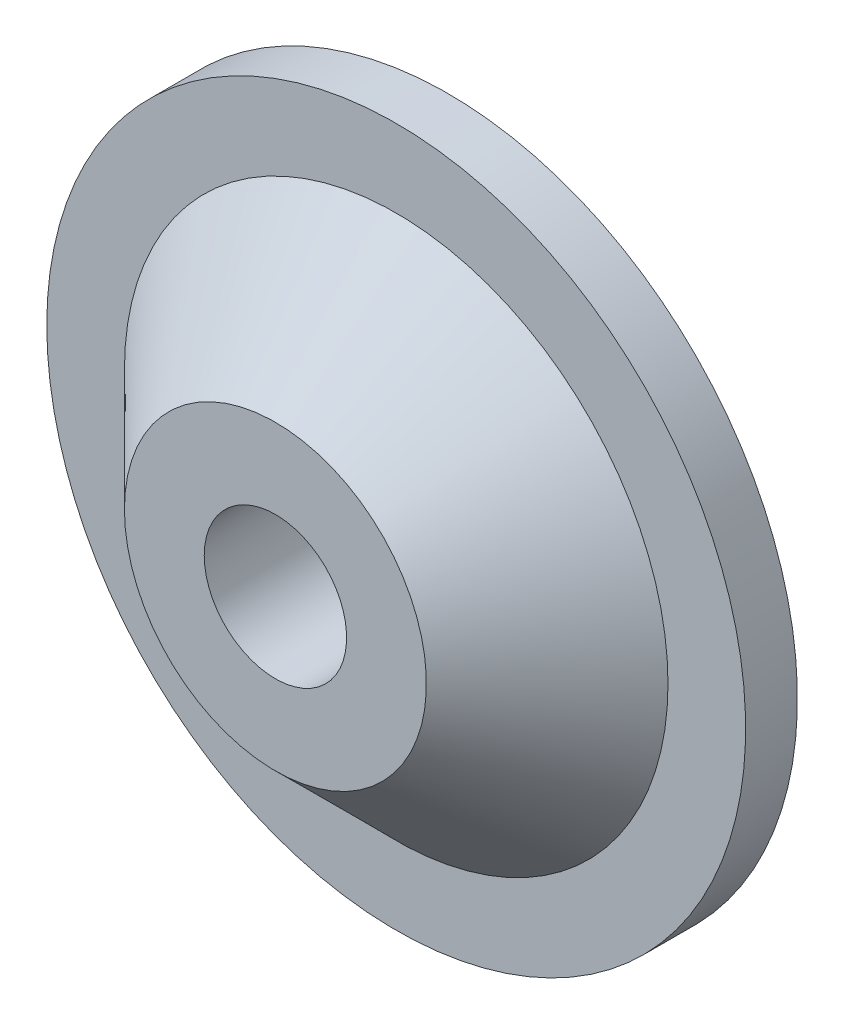
ISO-10303-21;
HEADER;
FILE_DESCRIPTION(('STEP AP214'),'2;1');
FILE_NAME('part.step','',(''),(''),'','','');
FILE_SCHEMA(('AUTOMOTIVE_DESIGN { 1 0 10303 214 1 1 1 1 }'));
ENDSEC;
DATA;
#1=APPLICATION_CONTEXT('core data for automotive mechanical design processes');
#2=APPLICATION_PROTOCOL_DEFINITION('international standard','automotive_design',2000,#1);
#3=PRODUCT_CONTEXT('',#1,'mechanical');
#4=PRODUCT('Part','Part','',(#3));
#5=PRODUCT_RELATED_PRODUCT_CATEGORY('part','',(#4));
#6=PRODUCT_DEFINITION_FORMATION('','',#4);
#7=PRODUCT_DEFINITION_CONTEXT('part definition',#1,'design');
#8=PRODUCT_DEFINITION('design','',#6,#7);
#9=PRODUCT_DEFINITION_SHAPE('','',#8);
#10=(LENGTH_UNIT() NAMED_UNIT(*) SI_UNIT(.MILLI.,.METRE.));
#11=(NAMED_UNIT(*) PLANE_ANGLE_UNIT() SI_UNIT($,.RADIAN.));
#12=(NAMED_UNIT(*) SI_UNIT($,.STERADIAN.) SOLID_ANGLE_UNIT());
#13=UNCERTAINTY_MEASURE_WITH_UNIT(LENGTH_MEASURE(1.E-05),#10,'distance_accuracy_value','');
#14=(GEOMETRIC_REPRESENTATION_CONTEXT(3) GLOBAL_UNCERTAINTY_ASSIGNED_CONTEXT((#13)) GLOBAL_UNIT_ASSIGNED_CONTEXT((#10,
#11,#12)) REPRESENTATION_CONTEXT('',''));
#15=CARTESIAN_POINT('',(0.,0.,0.));
#16=DIRECTION('',(0.,0.,1.));
#17=DIRECTION('',(1.,0.,0.));
#18=AXIS2_PLACEMENT_3D('',#15,#16,#17);
#19=CARTESIAN_POINT('',(0.,0.,2.8));
#20=DIRECTION('',(0.,0.,-1.));
#21=DIRECTION('',(-1.,0.,0.));
#22=AXIS2_PLACEMENT_3D('',#19,#20,#21);
#23=PLANE('',#22);
#24=CARTESIAN_POINT('',(0.,0.,2.8));
#25=DIRECTION('',(0.,0.,-1.));
#26=DIRECTION('',(-1.,0.,0.));
#27=AXIS2_PLACEMENT_3D('',#24,#25,#26);
#28=CIRCLE('',#27,3.5);
#29=CARTESIAN_POINT('',(-3.5,0.,2.8));
#30=VERTEX_POINT('',#29);
#31=EDGE_CURVE('E47',#30,#30,#28,.T.);
#32=ORIENTED_EDGE('',*,*,#31,.F.);
#33=EDGE_LOOP('',(#32));
#34=FACE_BOUND('',#33,.T.);
#35=CARTESIAN_POINT('',(0.,0.,2.8));
#36=DIRECTION('',(0.,0.,-1.));
#37=DIRECTION('',(-1.,0.,0.));
#38=AXIS2_PLACEMENT_3D('',#35,#36,#37);
#39=CIRCLE('',#38,1.65000000000001);
#40=CARTESIAN_POINT('',(-1.65000000000001,0.,2.8));
#41=VERTEX_POINT('',#40);
#42=EDGE_CURVE('E62',#41,#41,#39,.T.);
#43=ORIENTED_EDGE('',*,*,#42,.T.);
#44=EDGE_LOOP('',(#43));
#45=FACE_BOUND('',#44,.T.);
#46=ADVANCED_FACE('F36',(#34,#45),#23,.F.);
#47=CARTESIAN_POINT('',(0.,0.,2.8));
#48=DIRECTION('',(0.,0.,-1.));
#49=DIRECTION('',(-1.,0.,0.));
#50=AXIS2_PLACEMENT_3D('',#47,#48,#49);
#51=CONICAL_SURFACE('',#50,3.5,0.785398163397446);
#52=CARTESIAN_POINT('',(0.,0.,0.));
#53=DIRECTION('',(0.,0.,-1.));
#54=DIRECTION('',(-1.,0.,0.));
#55=AXIS2_PLACEMENT_3D('',#52,#53,#54);
#56=CIRCLE('',#55,6.29999999999998);
#57=CARTESIAN_POINT('',(-6.29999999999998,0.,0.));
#58=VERTEX_POINT('',#57);
#59=EDGE_CURVE('E51',#58,#58,#56,.T.);
#60=ORIENTED_EDGE('',*,*,#59,.F.);
#61=EDGE_LOOP('',(#60));
#62=FACE_BOUND('',#61,.T.);
#63=ORIENTED_EDGE('',*,*,#31,.T.);
#64=EDGE_LOOP('',(#63));
#65=FACE_BOUND('',#64,.T.);
#66=ADVANCED_FACE('F79',(#62,#65),#51,.T.);
#67=CARTESIAN_POINT('',(0.,0.,0.));
#68=DIRECTION('',(0.,0.,-1.));
#69=DIRECTION('',(-1.,0.,0.));
#70=AXIS2_PLACEMENT_3D('',#67,#68,#69);
#71=PLANE('',#70);
#72=CARTESIAN_POINT('',(0.,0.,0.));
#73=DIRECTION('',(0.,0.,-1.));
#74=DIRECTION('',(-1.,0.,0.));
#75=AXIS2_PLACEMENT_3D('',#72,#73,#74);
#76=CIRCLE('',#75,8.1);
#77=CARTESIAN_POINT('',(-8.1,0.,0.));
#78=VERTEX_POINT('',#77);
#79=EDGE_CURVE('E56',#78,#78,#76,.T.);
#80=ORIENTED_EDGE('',*,*,#79,.F.);
#81=EDGE_LOOP('',(#80));
#82=FACE_BOUND('',#81,.T.);
#83=ORIENTED_EDGE('',*,*,#59,.T.);
#84=EDGE_LOOP('',(#83));
#85=FACE_BOUND('',#84,.T.);
#86=ADVANCED_FACE('F84',(#82,#85),#71,.F.);
#87=CARTESIAN_POINT('',(0.,0.,-35.5800768174737));
#88=DIRECTION('',(0.,0.,-1.));
#89=DIRECTION('',(-1.,0.,0.));
#90=AXIS2_PLACEMENT_3D('',#87,#88,#89);
#91=CYLINDRICAL_SURFACE('',#90,8.1);
#92=CARTESIAN_POINT('',(0.,0.,-1.2));
#93=DIRECTION('',(0.,0.,-1.));
#94=DIRECTION('',(-1.,0.,0.));
#95=AXIS2_PLACEMENT_3D('',#92,#93,#94);
#96=CIRCLE('',#95,8.1);
#97=CARTESIAN_POINT('',(-8.1,0.,-1.2));
#98=VERTEX_POINT('',#97);
#99=EDGE_CURVE('E59',#98,#98,#96,.T.);
#100=ORIENTED_EDGE('',*,*,#99,.F.);
#101=EDGE_LOOP('',(#100));
#102=FACE_BOUND('',#101,.T.);
#103=ORIENTED_EDGE('',*,*,#79,.T.);
#104=EDGE_LOOP('',(#103));
#105=FACE_BOUND('',#104,.T.);
#106=ADVANCED_FACE('F76',(#102,#105),#91,.T.);
#107=CARTESIAN_POINT('',(0.,0.,-1.2));
#108=DIRECTION('',(0.,0.,1.));
#109=DIRECTION('',(1.,0.,0.));
#110=AXIS2_PLACEMENT_3D('',#107,#108,#109);
#111=PLANE('',#110);
#112=CARTESIAN_POINT('',(0.,0.,-1.2));
#113=DIRECTION('',(0.,0.,1.));
#114=DIRECTION('',(1.,0.,0.));
#115=AXIS2_PLACEMENT_3D('',#112,#113,#114);
#116=CIRCLE('',#115,2.15000000000001);
#117=CARTESIAN_POINT('',(2.15000000000001,0.,-1.2));
#118=VERTEX_POINT('',#117);
#119=EDGE_CURVE('E10',#118,#118,#116,.T.);
#120=ORIENTED_EDGE('',*,*,#119,.T.);
#121=EDGE_LOOP('',(#120));
#122=FACE_BOUND('',#121,.T.);
#123=ORIENTED_EDGE('',*,*,#99,.T.);
#124=EDGE_LOOP('',(#123));
#125=FACE_BOUND('',#124,.T.);
#126=ADVANCED_FACE('F69',(#122,#125),#111,.F.);
#127=CARTESIAN_POINT('',(0.,0.,-35.5800768174737));
#128=DIRECTION('',(0.,0.,-1.));
#129=DIRECTION('',(-1.,0.,0.));
#130=AXIS2_PLACEMENT_3D('',#127,#128,#129);
#131=CYLINDRICAL_SURFACE('',#130,1.65);
#132=CARTESIAN_POINT('',(0.,0.,-0.699999999999992));
#133=DIRECTION('',(0.,0.,1.));
#134=DIRECTION('',(1.,0.,0.));
#135=AXIS2_PLACEMENT_3D('',#132,#133,#134);
#136=CIRCLE('',#135,1.65);
#137=CARTESIAN_POINT('',(1.65,0.,-0.699999999999992));
#138=VERTEX_POINT('',#137);
#139=EDGE_CURVE('E43',#138,#138,#136,.F.);
#140=ORIENTED_EDGE('',*,*,#139,.T.);
#141=EDGE_LOOP('',(#140));
#142=FACE_BOUND('',#141,.T.);
#143=ORIENTED_EDGE('',*,*,#42,.F.);
#144=EDGE_LOOP('',(#143));
#145=FACE_BOUND('',#144,.T.);
#146=ADVANCED_FACE('F67',(#142,#145),#131,.F.);
#147=CARTESIAN_POINT('',(0.,0.,-0.699999999999992));
#148=DIRECTION('',(0.,0.,-1.));
#149=DIRECTION('',(-1.,0.,0.));
#150=AXIS2_PLACEMENT_3D('',#147,#148,#149);
#151=CONICAL_SURFACE('',#150,1.65,0.785398163397442);
#152=ORIENTED_EDGE('',*,*,#119,.F.);
#153=EDGE_LOOP('',(#152));
#154=FACE_BOUND('',#153,.T.);
#155=ORIENTED_EDGE('',*,*,#139,.F.);
#156=EDGE_LOOP('',(#155));
#157=FACE_BOUND('',#156,.T.);
#158=ADVANCED_FACE('F38',(#154,#157),#151,.F.);
#159=CLOSED_SHELL('',(#46,#66,#86,#106,#126,#146,#158));
#160=MANIFOLD_SOLID_BREP('B2',#159);
#161=ADVANCED_BREP_SHAPE_REPRESENTATION('',(#18,#160),#14);
#162=SHAPE_DEFINITION_REPRESENTATION(#9,#161);
ENDSEC;
END-ISO-10303-21;
